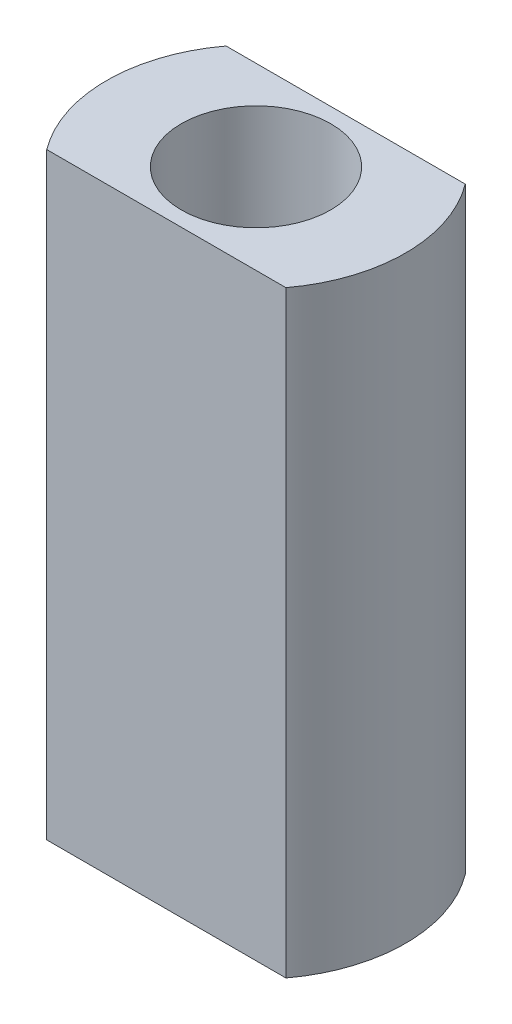
ISO-10303-21;
HEADER;
FILE_DESCRIPTION(('STEP AP214'),'2;1');
FILE_NAME('part.step','',(''),(''),'','','');
FILE_SCHEMA(('AUTOMOTIVE_DESIGN { 1 0 10303 214 1 1 1 1 }'));
ENDSEC;
DATA;
#1=APPLICATION_CONTEXT('core data for automotive mechanical design processes');
#2=APPLICATION_PROTOCOL_DEFINITION('international standard','automotive_design',2000,#1);
#3=PRODUCT_CONTEXT('',#1,'mechanical');
#4=PRODUCT('Part','Part','',(#3));
#5=PRODUCT_RELATED_PRODUCT_CATEGORY('part','',(#4));
#6=PRODUCT_DEFINITION_FORMATION('','',#4);
#7=PRODUCT_DEFINITION_CONTEXT('part definition',#1,'design');
#8=PRODUCT_DEFINITION('design','',#6,#7);
#9=PRODUCT_DEFINITION_SHAPE('','',#8);
#10=(LENGTH_UNIT() NAMED_UNIT(*) SI_UNIT(.MILLI.,.METRE.));
#11=(NAMED_UNIT(*) PLANE_ANGLE_UNIT() SI_UNIT($,.RADIAN.));
#12=(NAMED_UNIT(*) SI_UNIT($,.STERADIAN.) SOLID_ANGLE_UNIT());
#13=UNCERTAINTY_MEASURE_WITH_UNIT(LENGTH_MEASURE(1.E-05),#10,'distance_accuracy_value','');
#14=(GEOMETRIC_REPRESENTATION_CONTEXT(3) GLOBAL_UNCERTAINTY_ASSIGNED_CONTEXT((#13)) GLOBAL_UNIT_ASSIGNED_CONTEXT((#10,
#11,#12)) REPRESENTATION_CONTEXT('',''));
#15=CARTESIAN_POINT('',(0.,0.,0.));
#16=DIRECTION('',(0.,0.,1.));
#17=DIRECTION('',(1.,0.,0.));
#18=AXIS2_PLACEMENT_3D('',#15,#16,#17);
#19=CARTESIAN_POINT('',(0.,20.,0.));
#20=DIRECTION('',(0.,-1.,0.));
#21=DIRECTION('',(0.,0.,-1.));
#22=AXIS2_PLACEMENT_3D('',#19,#20,#21);
#23=CYLINDRICAL_SURFACE('',#22,5.);
#24=CARTESIAN_POINT('',(0.,0.,0.));
#25=DIRECTION('',(0.,1.,0.));
#26=DIRECTION('',(0.,0.,1.));
#27=AXIS2_PLACEMENT_3D('',#24,#25,#26);
#28=CIRCLE('',#27,5.);
#29=CARTESIAN_POINT('',(-4.,0.,-3.));
#30=VERTEX_POINT('',#29);
#31=CARTESIAN_POINT('',(-4.,0.,3.));
#32=VERTEX_POINT('',#31);
#33=EDGE_CURVE('E99',#30,#32,#28,.T.);
#34=ORIENTED_EDGE('',*,*,#33,.T.);
#35=DIRECTION('',(0.,-1.,0.));
#36=VECTOR('',#35,1.);
#37=CARTESIAN_POINT('',(-4.,20.,3.));
#38=LINE('',#37,#36);
#39=CARTESIAN_POINT('',(-4.,20.,3.));
#40=VERTEX_POINT('',#39);
#41=EDGE_CURVE('E11',#40,#32,#38,.T.);
#42=ORIENTED_EDGE('',*,*,#41,.F.);
#43=CARTESIAN_POINT('',(0.,20.,0.));
#44=DIRECTION('',(0.,1.,0.));
#45=DIRECTION('',(0.,0.,1.));
#46=AXIS2_PLACEMENT_3D('',#43,#44,#45);
#47=CIRCLE('',#46,5.);
#48=CARTESIAN_POINT('',(-4.,20.,-3.));
#49=VERTEX_POINT('',#48);
#50=EDGE_CURVE('E75',#49,#40,#47,.T.);
#51=ORIENTED_EDGE('',*,*,#50,.F.);
#52=DIRECTION('',(0.,-1.,0.));
#53=VECTOR('',#52,1.);
#54=CARTESIAN_POINT('',(-4.,20.,-3.));
#55=LINE('',#54,#53);
#56=EDGE_CURVE('E50',#49,#30,#55,.T.);
#57=ORIENTED_EDGE('',*,*,#56,.T.);
#58=EDGE_LOOP('',(#34,#42,#51,#57));
#59=FACE_BOUND('',#58,.T.);
#60=ADVANCED_FACE('F34',(#59),#23,.T.);
#61=CARTESIAN_POINT('',(0.,20.,3.));
#62=DIRECTION('',(0.,0.,1.));
#63=DIRECTION('',(1.,0.,0.));
#64=AXIS2_PLACEMENT_3D('',#61,#62,#63);
#65=PLANE('',#64);
#66=DIRECTION('',(-1.,0.,0.));
#67=VECTOR('',#66,1.);
#68=CARTESIAN_POINT('',(0.,0.,3.));
#69=LINE('',#68,#67);
#70=CARTESIAN_POINT('',(4.,0.,3.));
#71=VERTEX_POINT('',#70);
#72=EDGE_CURVE('E85',#71,#32,#69,.T.);
#73=ORIENTED_EDGE('',*,*,#72,.F.);
#74=DIRECTION('',(0.,-1.,0.));
#75=VECTOR('',#74,1.);
#76=CARTESIAN_POINT('',(4.,20.,3.));
#77=LINE('',#76,#75);
#78=CARTESIAN_POINT('',(4.,20.,3.));
#79=VERTEX_POINT('',#78);
#80=EDGE_CURVE('E42',#79,#71,#77,.T.);
#81=ORIENTED_EDGE('',*,*,#80,.F.);
#82=DIRECTION('',(-1.,0.,0.));
#83=VECTOR('',#82,1.);
#84=CARTESIAN_POINT('',(0.,20.,3.));
#85=LINE('',#84,#83);
#86=EDGE_CURVE('E83',#79,#40,#85,.T.);
#87=ORIENTED_EDGE('',*,*,#86,.T.);
#88=ORIENTED_EDGE('',*,*,#41,.T.);
#89=EDGE_LOOP('',(#73,#81,#87,#88));
#90=FACE_BOUND('',#89,.T.);
#91=ADVANCED_FACE('F82',(#90),#65,.T.);
#92=CARTESIAN_POINT('',(0.,20.,0.));
#93=DIRECTION('',(0.,-1.,0.));
#94=DIRECTION('',(0.,0.,-1.));
#95=AXIS2_PLACEMENT_3D('',#92,#93,#94);
#96=CYLINDRICAL_SURFACE('',#95,5.);
#97=CARTESIAN_POINT('',(0.,0.,0.));
#98=DIRECTION('',(0.,1.,0.));
#99=DIRECTION('',(0.,0.,1.));
#100=AXIS2_PLACEMENT_3D('',#97,#98,#99);
#101=CIRCLE('',#100,5.);
#102=CARTESIAN_POINT('',(4.,0.,-3.));
#103=VERTEX_POINT('',#102);
#104=EDGE_CURVE('E103',#71,#103,#101,.T.);
#105=ORIENTED_EDGE('',*,*,#104,.T.);
#106=DIRECTION('',(0.,-1.,0.));
#107=VECTOR('',#106,1.);
#108=CARTESIAN_POINT('',(4.,20.,-3.));
#109=LINE('',#108,#107);
#110=CARTESIAN_POINT('',(4.,20.,-3.));
#111=VERTEX_POINT('',#110);
#112=EDGE_CURVE('E64',#111,#103,#109,.T.);
#113=ORIENTED_EDGE('',*,*,#112,.F.);
#114=CARTESIAN_POINT('',(0.,20.,0.));
#115=DIRECTION('',(0.,1.,0.));
#116=DIRECTION('',(0.,0.,1.));
#117=AXIS2_PLACEMENT_3D('',#114,#115,#116);
#118=CIRCLE('',#117,5.);
#119=EDGE_CURVE('E88',#79,#111,#118,.T.);
#120=ORIENTED_EDGE('',*,*,#119,.F.);
#121=ORIENTED_EDGE('',*,*,#80,.T.);
#122=EDGE_LOOP('',(#105,#113,#120,#121));
#123=FACE_BOUND('',#122,.T.);
#124=ADVANCED_FACE('F89',(#123),#96,.T.);
#125=CARTESIAN_POINT('',(0.,20.,-3.));
#126=DIRECTION('',(0.,0.,-1.));
#127=DIRECTION('',(-1.,0.,0.));
#128=AXIS2_PLACEMENT_3D('',#125,#126,#127);
#129=PLANE('',#128);
#130=DIRECTION('',(1.,0.,0.));
#131=VECTOR('',#130,1.);
#132=CARTESIAN_POINT('',(0.,0.,-3.));
#133=LINE('',#132,#131);
#134=EDGE_CURVE('E94',#30,#103,#133,.T.);
#135=ORIENTED_EDGE('',*,*,#134,.F.);
#136=ORIENTED_EDGE('',*,*,#56,.F.);
#137=DIRECTION('',(1.,0.,0.));
#138=VECTOR('',#137,1.);
#139=CARTESIAN_POINT('',(0.,20.,-3.));
#140=LINE('',#139,#138);
#141=EDGE_CURVE('E90',#49,#111,#140,.T.);
#142=ORIENTED_EDGE('',*,*,#141,.T.);
#143=ORIENTED_EDGE('',*,*,#112,.T.);
#144=EDGE_LOOP('',(#135,#136,#142,#143));
#145=FACE_BOUND('',#144,.T.);
#146=ADVANCED_FACE('F110',(#145),#129,.T.);
#147=CARTESIAN_POINT('',(0.,20.,0.));
#148=DIRECTION('',(0.,1.,0.));
#149=DIRECTION('',(0.,0.,1.));
#150=AXIS2_PLACEMENT_3D('',#147,#148,#149);
#151=PLANE('',#150);
#152=CARTESIAN_POINT('',(0.,20.,0.));
#153=DIRECTION('',(0.,1.,0.));
#154=DIRECTION('',(0.,0.,1.));
#155=AXIS2_PLACEMENT_3D('',#152,#153,#154);
#156=CIRCLE('',#155,2.5);
#157=CARTESIAN_POINT('',(0.,20.,2.5));
#158=VERTEX_POINT('',#157);
#159=EDGE_CURVE('E172',#158,#158,#156,.T.);
#160=ORIENTED_EDGE('',*,*,#159,.F.);
#161=EDGE_LOOP('',(#160));
#162=FACE_BOUND('',#161,.T.);
#163=ORIENTED_EDGE('',*,*,#50,.T.);
#164=ORIENTED_EDGE('',*,*,#86,.F.);
#165=ORIENTED_EDGE('',*,*,#119,.T.);
#166=ORIENTED_EDGE('',*,*,#141,.F.);
#167=EDGE_LOOP('',(#163,#164,#165,#166));
#168=FACE_BOUND('',#167,.T.);
#169=ADVANCED_FACE('F92',(#162,#168),#151,.T.);
#170=CARTESIAN_POINT('',(0.,0.,0.));
#171=DIRECTION('',(0.,1.,0.));
#172=DIRECTION('',(0.,0.,1.));
#173=AXIS2_PLACEMENT_3D('',#170,#171,#172);
#174=PLANE('',#173);
#175=CARTESIAN_POINT('',(0.,0.,0.));
#176=DIRECTION('',(0.,1.,0.));
#177=DIRECTION('',(0.,0.,1.));
#178=AXIS2_PLACEMENT_3D('',#175,#176,#177);
#179=CIRCLE('',#178,2.5);
#180=CARTESIAN_POINT('',(0.,0.,2.5));
#181=VERTEX_POINT('',#180);
#182=EDGE_CURVE('E101',#181,#181,#179,.T.);
#183=ORIENTED_EDGE('',*,*,#182,.T.);
#184=EDGE_LOOP('',(#183));
#185=FACE_BOUND('',#184,.T.);
#186=ORIENTED_EDGE('',*,*,#33,.F.);
#187=ORIENTED_EDGE('',*,*,#134,.T.);
#188=ORIENTED_EDGE('',*,*,#104,.F.);
#189=ORIENTED_EDGE('',*,*,#72,.T.);
#190=EDGE_LOOP('',(#186,#187,#188,#189));
#191=FACE_BOUND('',#190,.T.);
#192=ADVANCED_FACE('F109',(#185,#191),#174,.F.);
#193=CARTESIAN_POINT('',(0.,0.,0.));
#194=DIRECTION('',(0.,1.,0.));
#195=DIRECTION('',(0.,0.,1.));
#196=AXIS2_PLACEMENT_3D('',#193,#194,#195);
#197=CYLINDRICAL_SURFACE('',#196,2.5);
#198=ORIENTED_EDGE('',*,*,#182,.F.);
#199=EDGE_LOOP('',(#198));
#200=FACE_BOUND('',#199,.T.);
#201=ORIENTED_EDGE('',*,*,#159,.T.);
#202=EDGE_LOOP('',(#201));
#203=FACE_BOUND('',#202,.T.);
#204=ADVANCED_FACE('F153',(#200,#203),#197,.F.);
#205=CLOSED_SHELL('',(#60,#91,#124,#146,#169,#192,#204));
#206=MANIFOLD_SOLID_BREP('B2',#205);
#207=ADVANCED_BREP_SHAPE_REPRESENTATION('',(#18,#206),#14);
#208=SHAPE_DEFINITION_REPRESENTATION(#9,#207);
ENDSEC;
END-ISO-10303-21;
